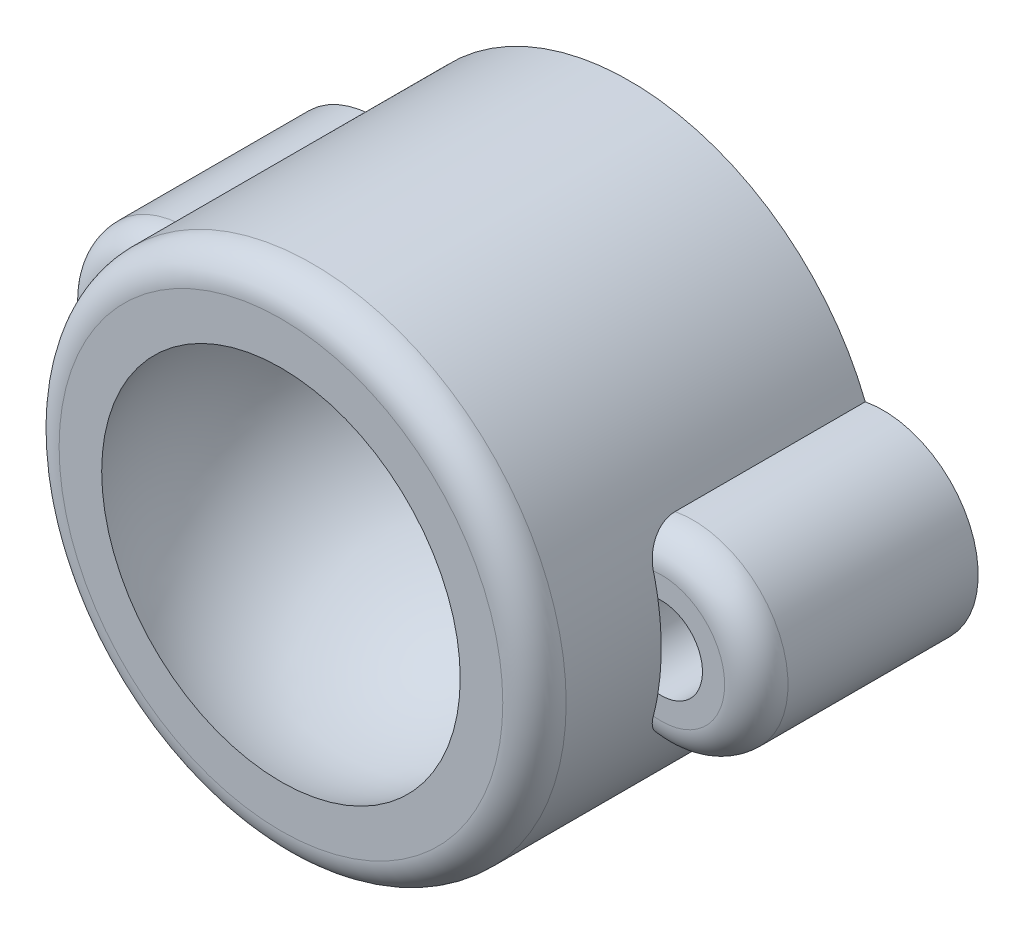
ISO-10303-21;
HEADER;
FILE_DESCRIPTION(('STEP AP214'),'2;1');
FILE_NAME('part.step','',(''),(''),'','','');
FILE_SCHEMA(('AUTOMOTIVE_DESIGN { 1 0 10303 214 1 1 1 1 }'));
ENDSEC;
DATA;
#1=APPLICATION_CONTEXT('core data for automotive mechanical design processes');
#2=APPLICATION_PROTOCOL_DEFINITION('international standard','automotive_design',2000,#1);
#3=PRODUCT_CONTEXT('',#1,'mechanical');
#4=PRODUCT('Part','Part','',(#3));
#5=PRODUCT_RELATED_PRODUCT_CATEGORY('part','',(#4));
#6=PRODUCT_DEFINITION_FORMATION('','',#4);
#7=PRODUCT_DEFINITION_CONTEXT('part definition',#1,'design');
#8=PRODUCT_DEFINITION('design','',#6,#7);
#9=PRODUCT_DEFINITION_SHAPE('','',#8);
#10=(LENGTH_UNIT() NAMED_UNIT(*) SI_UNIT(.MILLI.,.METRE.));
#11=(NAMED_UNIT(*) PLANE_ANGLE_UNIT() SI_UNIT($,.RADIAN.));
#12=(NAMED_UNIT(*) SI_UNIT($,.STERADIAN.) SOLID_ANGLE_UNIT());
#13=UNCERTAINTY_MEASURE_WITH_UNIT(LENGTH_MEASURE(1.E-05),#10,'distance_accuracy_value','');
#14=(GEOMETRIC_REPRESENTATION_CONTEXT(3) GLOBAL_UNCERTAINTY_ASSIGNED_CONTEXT((#13)) GLOBAL_UNIT_ASSIGNED_CONTEXT((#10,
#11,#12)) REPRESENTATION_CONTEXT('',''));
#15=CARTESIAN_POINT('',(0.,0.,0.));
#16=DIRECTION('',(0.,0.,1.));
#17=DIRECTION('',(1.,0.,0.));
#18=AXIS2_PLACEMENT_3D('',#15,#16,#17);
#19=CARTESIAN_POINT('',(8.,0.,10.));
#20=DIRECTION('',(0.,0.,-1.));
#21=DIRECTION('',(-1.,0.,0.));
#22=AXIS2_PLACEMENT_3D('',#19,#20,#21);
#23=CYLINDRICAL_SURFACE('',#22,1.3);
#24=CARTESIAN_POINT('',(8.,0.,-1.));
#25=DIRECTION('',(0.,0.,-1.));
#26=DIRECTION('',(-1.,0.,0.));
#27=AXIS2_PLACEMENT_3D('',#24,#25,#26);
#28=CIRCLE('',#27,1.3);
#29=CARTESIAN_POINT('',(6.7,0.,-1.));
#30=VERTEX_POINT('',#29);
#31=EDGE_CURVE('E118',#30,#30,#28,.T.);
#32=ORIENTED_EDGE('',*,*,#31,.T.);
#33=EDGE_LOOP('',(#32));
#34=FACE_BOUND('',#33,.T.);
#35=CARTESIAN_POINT('',(8.,0.,6.));
#36=DIRECTION('',(0.,0.,1.));
#37=DIRECTION('',(1.,0.,0.));
#38=AXIS2_PLACEMENT_3D('',#35,#36,#37);
#39=CIRCLE('',#38,1.3);
#40=CARTESIAN_POINT('',(7.894375,-1.2957018790505,6.));
#41=VERTEX_POINT('',#40);
#42=CARTESIAN_POINT('',(7.894375,1.2957018790505,6.));
#43=VERTEX_POINT('',#42);
#44=EDGE_CURVE('E134',#41,#43,#39,.T.);
#45=ORIENTED_EDGE('',*,*,#44,.T.);
#46=CARTESIAN_POINT('',(8.,0.,6.));
#47=DIRECTION('',(0.,0.,1.));
#48=DIRECTION('',(1.,0.,0.));
#49=AXIS2_PLACEMENT_3D('',#46,#47,#48);
#50=CIRCLE('',#49,1.3);
#51=EDGE_CURVE('E216',#41,#43,#50,.F.);
#52=ORIENTED_EDGE('',*,*,#51,.F.);
#53=EDGE_LOOP('',(#45,#52));
#54=FACE_BOUND('',#53,.T.);
#55=ADVANCED_FACE('F37',(#34,#54),#23,.F.);
#56=CARTESIAN_POINT('',(-8.,0.,10.));
#57=DIRECTION('',(0.,0.,-1.));
#58=DIRECTION('',(-1.,0.,0.));
#59=AXIS2_PLACEMENT_3D('',#56,#57,#58);
#60=CYLINDRICAL_SURFACE('',#59,1.3);
#61=CARTESIAN_POINT('',(-8.,0.,-1.));
#62=DIRECTION('',(0.,0.,-1.));
#63=DIRECTION('',(-1.,0.,0.));
#64=AXIS2_PLACEMENT_3D('',#61,#62,#63);
#65=CIRCLE('',#64,1.3);
#66=CARTESIAN_POINT('',(-9.3,0.,-1.));
#67=VERTEX_POINT('',#66);
#68=EDGE_CURVE('E227',#67,#67,#65,.T.);
#69=ORIENTED_EDGE('',*,*,#68,.T.);
#70=EDGE_LOOP('',(#69));
#71=FACE_BOUND('',#70,.T.);
#72=CARTESIAN_POINT('',(-8.,0.,6.));
#73=DIRECTION('',(0.,0.,1.));
#74=DIRECTION('',(1.,0.,0.));
#75=AXIS2_PLACEMENT_3D('',#72,#73,#74);
#76=CIRCLE('',#75,1.3);
#77=CARTESIAN_POINT('',(-7.894375,1.2957018790505,6.));
#78=VERTEX_POINT('',#77);
#79=CARTESIAN_POINT('',(-7.894375,-1.2957018790505,6.));
#80=VERTEX_POINT('',#79);
#81=EDGE_CURVE('E124',#78,#80,#76,.F.);
#82=ORIENTED_EDGE('',*,*,#81,.F.);
#83=CARTESIAN_POINT('',(-8.,0.,6.));
#84=DIRECTION('',(0.,0.,1.));
#85=DIRECTION('',(1.,0.,0.));
#86=AXIS2_PLACEMENT_3D('',#83,#84,#85);
#87=CIRCLE('',#86,1.3);
#88=EDGE_CURVE('E130',#80,#78,#87,.F.);
#89=ORIENTED_EDGE('',*,*,#88,.F.);
#90=EDGE_LOOP('',(#82,#89));
#91=FACE_BOUND('',#90,.T.);
#92=ADVANCED_FACE('F129',(#71,#91),#60,.F.);
#93=CARTESIAN_POINT('',(0.,0.,10.));
#94=DIRECTION('',(0.,0.,1.));
#95=DIRECTION('',(1.,0.,0.));
#96=AXIS2_PLACEMENT_3D('',#93,#94,#95);
#97=PLANE('',#96);
#98=CARTESIAN_POINT('',(0.,0.,10.));
#99=DIRECTION('',(0.,0.,1.));
#100=DIRECTION('',(1.,0.,0.));
#101=AXIS2_PLACEMENT_3D('',#98,#99,#100);
#102=CIRCLE('',#101,7.);
#103=CARTESIAN_POINT('',(7.,0.,10.));
#104=VERTEX_POINT('',#103);
#105=EDGE_CURVE('E147',#104,#104,#102,.T.);
#106=ORIENTED_EDGE('',*,*,#105,.T.);
#107=EDGE_LOOP('',(#106));
#108=FACE_BOUND('',#107,.T.);
#109=CARTESIAN_POINT('',(0.,0.,10.));
#110=DIRECTION('',(0.,0.,1.));
#111=DIRECTION('',(1.,0.,0.));
#112=AXIS2_PLACEMENT_3D('',#109,#110,#111);
#113=CIRCLE('',#112,5.65685424949238);
#114=CARTESIAN_POINT('',(5.65685424949238,0.,10.));
#115=VERTEX_POINT('',#114);
#116=EDGE_CURVE('E135',#115,#115,#113,.F.);
#117=ORIENTED_EDGE('',*,*,#116,.T.);
#118=EDGE_LOOP('',(#117));
#119=FACE_BOUND('',#118,.T.);
#120=ADVANCED_FACE('F188',(#108,#119),#97,.T.);
#121=CARTESIAN_POINT('',(8.,0.,10.));
#122=DIRECTION('',(0.,0.,-1.));
#123=DIRECTION('',(-1.,0.,0.));
#124=AXIS2_PLACEMENT_3D('',#121,#122,#123);
#125=CYLINDRICAL_SURFACE('',#124,3.);
#126=DIRECTION('',(0.,0.,-1.));
#127=VECTOR('',#126,1.);
#128=CARTESIAN_POINT('',(7.4375,2.94679380853157,10.));
#129=LINE('',#128,#127);
#130=CARTESIAN_POINT('',(7.4375,2.94679380853157,5.));
#131=VERTEX_POINT('',#130);
#132=CARTESIAN_POINT('',(7.4375,2.94679380853157,-1.));
#133=VERTEX_POINT('',#132);
#134=EDGE_CURVE('E246',#131,#133,#129,.T.);
#135=ORIENTED_EDGE('',*,*,#134,.F.);
#136=CARTESIAN_POINT('',(8.,0.,5.));
#137=DIRECTION('',(0.,0.,1.));
#138=DIRECTION('',(1.,0.,0.));
#139=AXIS2_PLACEMENT_3D('',#136,#137,#138);
#140=CIRCLE('',#139,3.);
#141=CARTESIAN_POINT('',(7.4375,-2.94679380853157,5.));
#142=VERTEX_POINT('',#141);
#143=EDGE_CURVE('E64',#131,#142,#140,.F.);
#144=ORIENTED_EDGE('',*,*,#143,.T.);
#145=DIRECTION('',(0.,0.,-1.));
#146=VECTOR('',#145,1.);
#147=CARTESIAN_POINT('',(7.4375,-2.94679380853157,10.));
#148=LINE('',#147,#146);
#149=CARTESIAN_POINT('',(7.4375,-2.94679380853157,-1.));
#150=VERTEX_POINT('',#149);
#151=EDGE_CURVE('E141',#142,#150,#148,.T.);
#152=ORIENTED_EDGE('',*,*,#151,.T.);
#153=CARTESIAN_POINT('',(8.,0.,-1.));
#154=DIRECTION('',(0.,0.,-1.));
#155=DIRECTION('',(-1.,0.,0.));
#156=AXIS2_PLACEMENT_3D('',#153,#154,#155);
#157=CIRCLE('',#156,3.);
#158=EDGE_CURVE('E233',#133,#150,#157,.T.);
#159=ORIENTED_EDGE('',*,*,#158,.F.);
#160=EDGE_LOOP('',(#135,#144,#152,#159));
#161=FACE_BOUND('',#160,.T.);
#162=ADVANCED_FACE('F179',(#161),#125,.T.);
#163=CARTESIAN_POINT('',(-8.,0.,10.));
#164=DIRECTION('',(0.,0.,-1.));
#165=DIRECTION('',(-1.,0.,0.));
#166=AXIS2_PLACEMENT_3D('',#163,#164,#165);
#167=CYLINDRICAL_SURFACE('',#166,3.);
#168=DIRECTION('',(0.,0.,-1.));
#169=VECTOR('',#168,1.);
#170=CARTESIAN_POINT('',(-7.4375,-2.94679380853157,10.));
#171=LINE('',#170,#169);
#172=CARTESIAN_POINT('',(-7.4375,-2.94679380853157,5.));
#173=VERTEX_POINT('',#172);
#174=CARTESIAN_POINT('',(-7.4375,-2.94679380853157,-1.));
#175=VERTEX_POINT('',#174);
#176=EDGE_CURVE('E242',#173,#175,#171,.T.);
#177=ORIENTED_EDGE('',*,*,#176,.F.);
#178=CARTESIAN_POINT('',(-8.,0.,5.));
#179=DIRECTION('',(0.,0.,1.));
#180=DIRECTION('',(1.,0.,0.));
#181=AXIS2_PLACEMENT_3D('',#178,#179,#180);
#182=CIRCLE('',#181,3.);
#183=CARTESIAN_POINT('',(-7.4375,2.94679380853157,5.));
#184=VERTEX_POINT('',#183);
#185=EDGE_CURVE('E152',#173,#184,#182,.F.);
#186=ORIENTED_EDGE('',*,*,#185,.T.);
#187=DIRECTION('',(0.,0.,-1.));
#188=VECTOR('',#187,1.);
#189=CARTESIAN_POINT('',(-7.4375,2.94679380853157,10.));
#190=LINE('',#189,#188);
#191=CARTESIAN_POINT('',(-7.4375,2.94679380853157,-1.));
#192=VERTEX_POINT('',#191);
#193=EDGE_CURVE('E244',#184,#192,#190,.T.);
#194=ORIENTED_EDGE('',*,*,#193,.T.);
#195=CARTESIAN_POINT('',(-8.,0.,-1.));
#196=DIRECTION('',(0.,0.,-1.));
#197=DIRECTION('',(-1.,0.,0.));
#198=AXIS2_PLACEMENT_3D('',#195,#196,#197);
#199=CIRCLE('',#198,3.);
#200=EDGE_CURVE('E239',#175,#192,#199,.T.);
#201=ORIENTED_EDGE('',*,*,#200,.F.);
#202=EDGE_LOOP('',(#177,#186,#194,#201));
#203=FACE_BOUND('',#202,.T.);
#204=ADVANCED_FACE('F176',(#203),#167,.T.);
#205=CARTESIAN_POINT('',(0.,0.,10.));
#206=DIRECTION('',(0.,0.,-1.));
#207=DIRECTION('',(-1.,0.,0.));
#208=AXIS2_PLACEMENT_3D('',#205,#206,#207);
#209=CYLINDRICAL_SURFACE('',#208,8.);
#210=CARTESIAN_POINT('',(0.,0.,9.));
#211=DIRECTION('',(0.,0.,1.));
#212=DIRECTION('',(1.,0.,0.));
#213=AXIS2_PLACEMENT_3D('',#210,#211,#212);
#214=CIRCLE('',#213,8.);
#215=CARTESIAN_POINT('',(8.,0.,9.));
#216=VERTEX_POINT('',#215);
#217=EDGE_CURVE('E138',#216,#216,#214,.F.);
#218=ORIENTED_EDGE('',*,*,#217,.T.);
#219=EDGE_LOOP('',(#218));
#220=FACE_BOUND('',#219,.T.);
#221=ORIENTED_EDGE('',*,*,#151,.F.);
#222=CARTESIAN_POINT('',(7.4375,-2.94679380853157,5.));
#223=CARTESIAN_POINT('',(7.43749914967143,-2.94679365245571,5.02780694335322));
#224=CARTESIAN_POINT('',(7.43793530920502,-2.9456953717496,5.05560039717754));
#225=CARTESIAN_POINT('',(7.43966933334663,-2.94131406442235,5.11098487867296));
#226=CARTESIAN_POINT('',(7.44096711696417,-2.93803124314241,5.1385759251234));
#227=CARTESIAN_POINT('',(7.44612689495147,-2.92494235336624,5.22066823904981));
#228=CARTESIAN_POINT('',(7.45125543029441,-2.91189573528143,5.27461394668986));
#229=CARTESIAN_POINT('',(7.46459729232654,-2.87752025899398,5.3793763743999));
#230=CARTESIAN_POINT('',(7.47281143077608,-2.85618922127647,5.43019226697993));
#231=CARTESIAN_POINT('',(7.49186558704944,-2.80582824179646,5.52732026767199));
#232=CARTESIAN_POINT('',(7.50270561540124,-2.77679826916661,5.57363235772591));
#233=CARTESIAN_POINT('',(7.52654347353893,-2.71152313666179,5.66089677085347));
#234=CARTESIAN_POINT('',(7.53955963831473,-2.67521609791732,5.70179775762281));
#235=CARTESIAN_POINT('',(7.56702747849928,-2.59650332570357,5.77667864378983));
#236=CARTESIAN_POINT('',(7.58147949283017,-2.55409615127744,5.81065690332509));
#237=CARTESIAN_POINT('',(7.61134747422596,-2.46367318485199,5.87121038110619));
#238=CARTESIAN_POINT('',(7.62677404979291,-2.41558761211684,5.89767610492232));
#239=CARTESIAN_POINT('',(7.65772689778493,-2.31558885867911,5.94183929000894));
#240=CARTESIAN_POINT('',(7.67325311444668,-2.26367767294395,5.95954128470422));
#241=CARTESIAN_POINT('',(7.69913108173308,-2.17367361477196,5.98170434798389));
#242=CARTESIAN_POINT('',(7.70961788130499,-2.13619036241575,5.98855650776272));
#243=CARTESIAN_POINT('',(7.73016509990778,-2.06060620783638,5.99770469740351));
#244=CARTESIAN_POINT('',(7.74022601400259,-2.02250609813879,6.00000616787696));
#245=CARTESIAN_POINT('',(7.75,-1.98431348329844,6.));
#246=B_SPLINE_CURVE_WITH_KNOTS('',3,(#222,#223,#224,#225,#226,#227,#228,#229,#230,#231,#232,
#233,#234,#235,#236,#237,#238,#239,#240,#241,#242,#243,#244,#245),.UNSPECIFIED.,.F.,.F.,(4,2,2,
2,2,2,2,2,2,2,2,4),(0.,0.0833690306080117,0.166730225847924,0.33308165267096,0.499476873904982,
0.665872762277385,0.833748659115344,1.00166427644296,1.17191446830836,1.34207649850148,
1.46038521913316,1.57855240913664),.UNSPECIFIED.);
#247=CARTESIAN_POINT('',(7.75,-1.98431348329844,6.));
#248=VERTEX_POINT('',#247);
#249=EDGE_CURVE('E11',#142,#248,#246,.T.);
#250=ORIENTED_EDGE('',*,*,#249,.T.);
#251=CARTESIAN_POINT('',(0.,0.,6.));
#252=DIRECTION('',(0.,0.,1.));
#253=DIRECTION('',(1.,0.,0.));
#254=AXIS2_PLACEMENT_3D('',#251,#252,#253);
#255=CIRCLE('',#254,8.);
#256=EDGE_CURVE('E222',#248,#41,#255,.T.);
#257=ORIENTED_EDGE('',*,*,#256,.T.);
#258=CARTESIAN_POINT('',(0.,0.,6.));
#259=DIRECTION('',(0.,0.,1.));
#260=DIRECTION('',(1.,0.,0.));
#261=AXIS2_PLACEMENT_3D('',#258,#259,#260);
#262=CIRCLE('',#261,8.);
#263=EDGE_CURVE('E131',#41,#43,#262,.T.);
#264=ORIENTED_EDGE('',*,*,#263,.T.);
#265=CARTESIAN_POINT('',(7.75,1.98431348329844,6.));
#266=VERTEX_POINT('',#265);
#267=EDGE_CURVE('E125',#43,#266,#255,.T.);
#268=ORIENTED_EDGE('',*,*,#267,.T.);
#269=CARTESIAN_POINT('',(7.75,1.98431348329844,6.));
#270=CARTESIAN_POINT('',(7.73588970065646,2.03951647568989,6.00004391657061));
#271=CARTESIAN_POINT('',(7.72115056178793,2.09453739091236,5.99520917665906));
#272=CARTESIAN_POINT('',(7.6909839345303,2.20268385680848,5.97615220468387));
#273=CARTESIAN_POINT('',(7.67555705672823,2.25581101623275,5.96193815085778));
#274=CARTESIAN_POINT('',(7.64455259805942,2.35875723932503,5.92448493485248));
#275=CARTESIAN_POINT('',(7.62897496862147,2.40857519317771,5.90124276261044));
#276=CARTESIAN_POINT('',(7.59834096449842,2.50353733491436,5.84638922465239));
#277=CARTESIAN_POINT('',(7.58328453502783,2.54868201502459,5.81477874160347));
#278=CARTESIAN_POINT('',(7.55436089169146,2.63317971291679,5.74396177530477));
#279=CARTESIAN_POINT('',(7.54049628524016,2.67252016063402,5.70473921982168));
#280=CARTESIAN_POINT('',(7.51469672939064,2.74422824537131,5.61980228202709));
#281=CARTESIAN_POINT('',(7.50276207436262,2.77659481893527,5.57408691137786));
#282=CARTESIAN_POINT('',(7.48155301852927,2.8332448570918,5.47779006460225));
#283=CARTESIAN_POINT('',(7.47226057792841,2.85758332609712,5.42724489748229));
#284=CARTESIAN_POINT('',(7.45676218709904,2.89778627764077,5.32246482287268));
#285=CARTESIAN_POINT('',(7.4505538727527,2.91365725157737,5.26823277790365));
#286=CARTESIAN_POINT('',(7.44323417375325,2.93228996233289,5.17801745784974));
#287=CARTESIAN_POINT('',(7.44108831373042,2.93772539724081,5.14264509864592));
#288=CARTESIAN_POINT('',(7.43821998342509,2.94497675615396,5.07152071376647));
#289=CARTESIAN_POINT('',(7.43749567827927,2.94679734603392,5.03576923747494));
#290=CARTESIAN_POINT('',(7.4375,2.94679380853157,5.));
#291=B_SPLINE_CURVE_WITH_KNOTS('',3,(#269,#270,#271,#272,#273,#274,#275,#276,#277,#278,#279,
#280,#281,#282,#283,#284,#285,#286,#287,#288,#289,#290),.UNSPECIFIED.,.F.,.F.,(4,2,2,2,2,2,2,2,
2,2,4),(0.,0.170695975450845,0.341243309877362,0.511847555324973,0.682433813056709,
0.853384246396927,1.0243607297941,1.19414018482296,1.3637892948702,1.4711476478983,
1.57836733741314),.UNSPECIFIED.);
#292=EDGE_CURVE('E51',#266,#131,#291,.T.);
#293=ORIENTED_EDGE('',*,*,#292,.T.);
#294=ORIENTED_EDGE('',*,*,#134,.T.);
#295=CARTESIAN_POINT('',(0.,0.,-1.));
#296=DIRECTION('',(0.,0.,-1.));
#297=DIRECTION('',(-1.,0.,0.));
#298=AXIS2_PLACEMENT_3D('',#295,#296,#297);
#299=CIRCLE('',#298,8.);
#300=EDGE_CURVE('E230',#192,#133,#299,.T.);
#301=ORIENTED_EDGE('',*,*,#300,.F.);
#302=ORIENTED_EDGE('',*,*,#193,.F.);
#303=CARTESIAN_POINT('',(-7.4375,2.94679380853157,5.));
#304=CARTESIAN_POINT('',(-7.43749914967143,2.94679365245571,5.02780694335322));
#305=CARTESIAN_POINT('',(-7.43793530920502,2.9456953717496,5.05560039717754));
#306=CARTESIAN_POINT('',(-7.43966933334663,2.94131406442235,5.11098487867296));
#307=CARTESIAN_POINT('',(-7.44096711696417,2.93803124314241,5.1385759251234));
#308=CARTESIAN_POINT('',(-7.44612689495147,2.92494235336624,5.22066823904981));
#309=CARTESIAN_POINT('',(-7.45125543029441,2.91189573528143,5.27461394668986));
#310=CARTESIAN_POINT('',(-7.46459729232654,2.87752025899398,5.3793763743999));
#311=CARTESIAN_POINT('',(-7.47281143077608,2.85618922127647,5.43019226697993));
#312=CARTESIAN_POINT('',(-7.49186558704944,2.80582824179646,5.52732026767199));
#313=CARTESIAN_POINT('',(-7.50270561540124,2.77679826916661,5.57363235772591));
#314=CARTESIAN_POINT('',(-7.52654347353893,2.71152313666179,5.66089677085347));
#315=CARTESIAN_POINT('',(-7.53955963831473,2.67521609791732,5.70179775762281));
#316=CARTESIAN_POINT('',(-7.56702747849928,2.59650332570357,5.77667864378983));
#317=CARTESIAN_POINT('',(-7.58147949283017,2.55409615127744,5.81065690332509));
#318=CARTESIAN_POINT('',(-7.61134747422596,2.46367318485199,5.87121038110619));
#319=CARTESIAN_POINT('',(-7.62677404979291,2.41558761211684,5.89767610492232));
#320=CARTESIAN_POINT('',(-7.65772689778493,2.31558885867911,5.94183929000894));
#321=CARTESIAN_POINT('',(-7.67325311444668,2.26367767294395,5.95954128470422));
#322=CARTESIAN_POINT('',(-7.69913108173308,2.17367361477196,5.98170434798389));
#323=CARTESIAN_POINT('',(-7.70961788130499,2.13619036241575,5.98855650776272));
#324=CARTESIAN_POINT('',(-7.73016509990778,2.06060620783638,5.99770469740351));
#325=CARTESIAN_POINT('',(-7.74022601400259,2.02250609813879,6.00000616787696));
#326=CARTESIAN_POINT('',(-7.75,1.98431348329844,6.));
#327=B_SPLINE_CURVE_WITH_KNOTS('',3,(#303,#304,#305,#306,#307,#308,#309,#310,#311,#312,#313,
#314,#315,#316,#317,#318,#319,#320,#321,#322,#323,#324,#325,#326),.UNSPECIFIED.,.F.,.F.,(4,2,2,
2,2,2,2,2,2,2,2,4),(0.,0.0833690306080117,0.166730225847924,0.33308165267096,0.499476873904982,
0.665872762277385,0.833748659115344,1.00166427644296,1.17191446830836,1.34207649850148,
1.46038521913316,1.57855240913664),.UNSPECIFIED.);
#328=CARTESIAN_POINT('',(-7.75,1.98431348329844,6.));
#329=VERTEX_POINT('',#328);
#330=EDGE_CURVE('E113',#184,#329,#327,.T.);
#331=ORIENTED_EDGE('',*,*,#330,.T.);
#332=CARTESIAN_POINT('',(0.,0.,6.));
#333=DIRECTION('',(0.,0.,1.));
#334=DIRECTION('',(1.,0.,0.));
#335=AXIS2_PLACEMENT_3D('',#332,#333,#334);
#336=CIRCLE('',#335,8.);
#337=EDGE_CURVE('E105',#329,#78,#336,.T.);
#338=ORIENTED_EDGE('',*,*,#337,.T.);
#339=CARTESIAN_POINT('',(0.,0.,6.));
#340=DIRECTION('',(0.,0.,1.));
#341=DIRECTION('',(1.,0.,0.));
#342=AXIS2_PLACEMENT_3D('',#339,#340,#341);
#343=CIRCLE('',#342,8.);
#344=EDGE_CURVE('E109',#78,#80,#343,.T.);
#345=ORIENTED_EDGE('',*,*,#344,.T.);
#346=CARTESIAN_POINT('',(-7.75,-1.98431348329844,6.));
#347=VERTEX_POINT('',#346);
#348=EDGE_CURVE('E119',#80,#347,#336,.T.);
#349=ORIENTED_EDGE('',*,*,#348,.T.);
#350=CARTESIAN_POINT('',(-7.75,-1.98431348329844,6.));
#351=CARTESIAN_POINT('',(-7.73588970065646,-2.03951647568989,6.00004391657061));
#352=CARTESIAN_POINT('',(-7.72115056178793,-2.09453739091236,5.99520917665906));
#353=CARTESIAN_POINT('',(-7.6909839345303,-2.20268385680848,5.97615220468387));
#354=CARTESIAN_POINT('',(-7.67555705672823,-2.25581101623275,5.96193815085778));
#355=CARTESIAN_POINT('',(-7.64455259805942,-2.35875723932503,5.92448493485248));
#356=CARTESIAN_POINT('',(-7.62897496862147,-2.40857519317771,5.90124276261044));
#357=CARTESIAN_POINT('',(-7.59834096449842,-2.50353733491436,5.84638922465239));
#358=CARTESIAN_POINT('',(-7.58328453502783,-2.54868201502459,5.81477874160347));
#359=CARTESIAN_POINT('',(-7.55436089169146,-2.63317971291679,5.74396177530477));
#360=CARTESIAN_POINT('',(-7.54049628524016,-2.67252016063402,5.70473921982168));
#361=CARTESIAN_POINT('',(-7.51469672939064,-2.74422824537131,5.61980228202709));
#362=CARTESIAN_POINT('',(-7.50276207436262,-2.77659481893527,5.57408691137786));
#363=CARTESIAN_POINT('',(-7.48155301852927,-2.8332448570918,5.47779006460225));
#364=CARTESIAN_POINT('',(-7.47226057792841,-2.85758332609712,5.42724489748229));
#365=CARTESIAN_POINT('',(-7.45676218709904,-2.89778627764077,5.32246482287268));
#366=CARTESIAN_POINT('',(-7.4505538727527,-2.91365725157737,5.26823277790365));
#367=CARTESIAN_POINT('',(-7.44323417375325,-2.93228996233289,5.17801745784974));
#368=CARTESIAN_POINT('',(-7.44108831373042,-2.93772539724081,5.14264509864592));
#369=CARTESIAN_POINT('',(-7.43821998342509,-2.94497675615396,5.07152071376647));
#370=CARTESIAN_POINT('',(-7.43749567827927,-2.94679734603392,5.03576923747494));
#371=CARTESIAN_POINT('',(-7.4375,-2.94679380853157,5.));
#372=B_SPLINE_CURVE_WITH_KNOTS('',3,(#350,#351,#352,#353,#354,#355,#356,#357,#358,#359,#360,
#361,#362,#363,#364,#365,#366,#367,#368,#369,#370,#371),.UNSPECIFIED.,.F.,.F.,(4,2,2,2,2,2,2,2,
2,2,4),(0.,0.170695975450845,0.341243309877362,0.511847555324973,0.682433813056709,
0.853384246396927,1.0243607297941,1.19414018482296,1.3637892948702,1.4711476478983,
1.57836733741314),.UNSPECIFIED.);
#373=EDGE_CURVE('E158',#347,#173,#372,.T.);
#374=ORIENTED_EDGE('',*,*,#373,.T.);
#375=ORIENTED_EDGE('',*,*,#176,.T.);
#376=CARTESIAN_POINT('',(0.,0.,-1.));
#377=DIRECTION('',(0.,0.,-1.));
#378=DIRECTION('',(-1.,0.,0.));
#379=AXIS2_PLACEMENT_3D('',#376,#377,#378);
#380=CIRCLE('',#379,8.);
#381=EDGE_CURVE('E236',#150,#175,#380,.T.);
#382=ORIENTED_EDGE('',*,*,#381,.F.);
#383=EDGE_LOOP('',(#221,#250,#257,#264,#268,#293,#294,#301,#302,#331,#338,#345,#349,#374,#375,#382));
#384=FACE_BOUND('',#383,.T.);
#385=ADVANCED_FACE('F107',(#220,#384),#209,.T.);
#386=CARTESIAN_POINT('',(0.,0.,8.));
#387=DIRECTION('',(0.,0.,-1.));
#388=DIRECTION('',(0.,1.,0.));
#389=AXIS2_PLACEMENT_3D('',#386,#387,#388);
#390=SPHERICAL_SURFACE('',#389,6.);
#391=ORIENTED_EDGE('',*,*,#116,.F.);
#392=EDGE_LOOP('',(#391));
#393=FACE_BOUND('',#392,.T.);
#394=ADVANCED_FACE('F175',(#393),#390,.F.);
#395=CARTESIAN_POINT('',(4.,0.,-1.));
#396=DIRECTION('',(0.,0.,-1.));
#397=DIRECTION('',(-1.,0.,0.));
#398=AXIS2_PLACEMENT_3D('',#395,#396,#397);
#399=PLANE('',#398);
#400=ORIENTED_EDGE('',*,*,#68,.F.);
#401=EDGE_LOOP('',(#400));
#402=FACE_BOUND('',#401,.T.);
#403=ORIENTED_EDGE('',*,*,#300,.T.);
#404=ORIENTED_EDGE('',*,*,#158,.T.);
#405=ORIENTED_EDGE('',*,*,#381,.T.);
#406=ORIENTED_EDGE('',*,*,#200,.T.);
#407=EDGE_LOOP('',(#403,#404,#405,#406));
#408=FACE_BOUND('',#407,.T.);
#409=ORIENTED_EDGE('',*,*,#31,.F.);
#410=EDGE_LOOP('',(#409));
#411=FACE_BOUND('',#410,.T.);
#412=ADVANCED_FACE('F251',(#402,#408,#411),#399,.T.);
#413=CARTESIAN_POINT('',(0.,0.,6.));
#414=DIRECTION('',(0.,0.,1.));
#415=DIRECTION('',(1.,0.,0.));
#416=AXIS2_PLACEMENT_3D('',#413,#414,#415);
#417=PLANE('',#416);
#418=ORIENTED_EDGE('',*,*,#337,.F.);
#419=CARTESIAN_POINT('',(-8.,0.,6.));
#420=DIRECTION('',(0.,0.,1.));
#421=DIRECTION('',(1.,0.,0.));
#422=AXIS2_PLACEMENT_3D('',#419,#420,#421);
#423=CIRCLE('',#422,2.);
#424=EDGE_CURVE('E150',#329,#347,#423,.T.);
#425=ORIENTED_EDGE('',*,*,#424,.T.);
#426=ORIENTED_EDGE('',*,*,#348,.F.);
#427=ORIENTED_EDGE('',*,*,#88,.T.);
#428=EDGE_LOOP('',(#418,#425,#426,#427));
#429=FACE_BOUND('',#428,.T.);
#430=ADVANCED_FACE('F133',(#429),#417,.T.);
#431=CARTESIAN_POINT('',(0.,0.,6.));
#432=DIRECTION('',(0.,0.,1.));
#433=DIRECTION('',(1.,0.,0.));
#434=AXIS2_PLACEMENT_3D('',#431,#432,#433);
#435=PLANE('',#434);
#436=ORIENTED_EDGE('',*,*,#256,.F.);
#437=CARTESIAN_POINT('',(8.,0.,6.));
#438=DIRECTION('',(0.,0.,1.));
#439=DIRECTION('',(1.,0.,0.));
#440=AXIS2_PLACEMENT_3D('',#437,#438,#439);
#441=CIRCLE('',#440,2.);
#442=EDGE_CURVE('E154',#248,#266,#441,.T.);
#443=ORIENTED_EDGE('',*,*,#442,.T.);
#444=ORIENTED_EDGE('',*,*,#267,.F.);
#445=ORIENTED_EDGE('',*,*,#44,.F.);
#446=EDGE_LOOP('',(#436,#443,#444,#445));
#447=FACE_BOUND('',#446,.T.);
#448=ADVANCED_FACE('F260',(#447),#435,.T.);
#449=CARTESIAN_POINT('',(0.,0.,6.));
#450=DIRECTION('',(0.,0.,1.));
#451=DIRECTION('',(1.,0.,0.));
#452=AXIS2_PLACEMENT_3D('',#449,#450,#451);
#453=PLANE('',#452);
#454=ORIENTED_EDGE('',*,*,#81,.T.);
#455=ORIENTED_EDGE('',*,*,#344,.F.);
#456=EDGE_LOOP('',(#454,#455));
#457=FACE_BOUND('',#456,.T.);
#458=ADVANCED_FACE('F123',(#457),#453,.F.);
#459=CARTESIAN_POINT('',(0.,0.,6.));
#460=DIRECTION('',(0.,0.,1.));
#461=DIRECTION('',(1.,0.,0.));
#462=AXIS2_PLACEMENT_3D('',#459,#460,#461);
#463=PLANE('',#462);
#464=ORIENTED_EDGE('',*,*,#51,.T.);
#465=ORIENTED_EDGE('',*,*,#263,.F.);
#466=EDGE_LOOP('',(#464,#465));
#467=FACE_BOUND('',#466,.T.);
#468=ADVANCED_FACE('F191',(#467),#463,.F.);
#469=CARTESIAN_POINT('',(0.,0.,9.));
#470=DIRECTION('',(0.,0.,1.));
#471=DIRECTION('',(1.,0.,0.));
#472=AXIS2_PLACEMENT_3D('',#469,#470,#471);
#473=TOROIDAL_SURFACE('',#472,7.,1.);
#474=ORIENTED_EDGE('',*,*,#105,.F.);
#475=EDGE_LOOP('',(#474));
#476=FACE_BOUND('',#475,.T.);
#477=ORIENTED_EDGE('',*,*,#217,.F.);
#478=EDGE_LOOP('',(#477));
#479=FACE_BOUND('',#478,.T.);
#480=ADVANCED_FACE('F189',(#476,#479),#473,.T.);
#481=CARTESIAN_POINT('',(-8.,0.,5.));
#482=DIRECTION('',(0.,0.,1.));
#483=DIRECTION('',(1.,0.,0.));
#484=AXIS2_PLACEMENT_3D('',#481,#482,#483);
#485=TOROIDAL_SURFACE('',#484,2.,1.);
#486=ORIENTED_EDGE('',*,*,#330,.F.);
#487=ORIENTED_EDGE('',*,*,#185,.F.);
#488=ORIENTED_EDGE('',*,*,#373,.F.);
#489=ORIENTED_EDGE('',*,*,#424,.F.);
#490=EDGE_LOOP('',(#486,#487,#488,#489));
#491=FACE_BOUND('',#490,.T.);
#492=ADVANCED_FACE('F168',(#491),#485,.T.);
#493=CARTESIAN_POINT('',(8.,0.,5.));
#494=DIRECTION('',(0.,0.,1.));
#495=DIRECTION('',(1.,0.,0.));
#496=AXIS2_PLACEMENT_3D('',#493,#494,#495);
#497=TOROIDAL_SURFACE('',#496,2.,1.);
#498=ORIENTED_EDGE('',*,*,#249,.F.);
#499=ORIENTED_EDGE('',*,*,#143,.F.);
#500=ORIENTED_EDGE('',*,*,#292,.F.);
#501=ORIENTED_EDGE('',*,*,#442,.F.);
#502=EDGE_LOOP('',(#498,#499,#500,#501));
#503=FACE_BOUND('',#502,.T.);
#504=ADVANCED_FACE('F39',(#503),#497,.T.);
#505=CLOSED_SHELL('',(#55,#92,#120,#162,#204,#385,#394,#412,#430,#448,#458,#468,#480,#492,#504));
#506=MANIFOLD_SOLID_BREP('B2',#505);
#507=ADVANCED_BREP_SHAPE_REPRESENTATION('',(#18,#506),#14);
#508=SHAPE_DEFINITION_REPRESENTATION(#9,#507);
ENDSEC;
END-ISO-10303-21;
